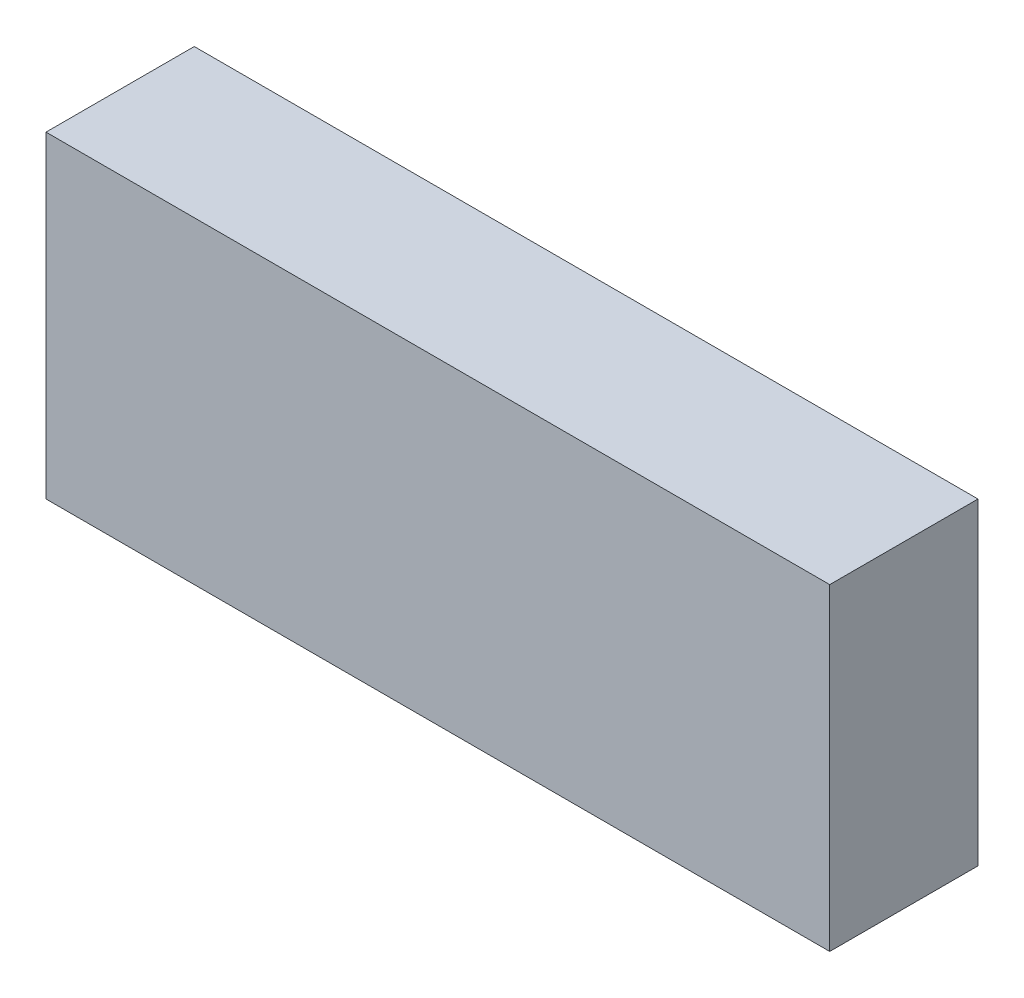
ISO-10303-21;
HEADER;
FILE_DESCRIPTION(('STEP AP214'),'2;1');
FILE_NAME('part.step','',(''),(''),'','','');
FILE_SCHEMA(('AUTOMOTIVE_DESIGN { 1 0 10303 214 1 1 1 1 }'));
ENDSEC;
DATA;
#1=APPLICATION_CONTEXT('core data for automotive mechanical design processes');
#2=APPLICATION_PROTOCOL_DEFINITION('international standard','automotive_design',2000,#1);
#3=PRODUCT_CONTEXT('',#1,'mechanical');
#4=PRODUCT('Part','Part','',(#3));
#5=PRODUCT_RELATED_PRODUCT_CATEGORY('part','',(#4));
#6=PRODUCT_DEFINITION_FORMATION('','',#4);
#7=PRODUCT_DEFINITION_CONTEXT('part definition',#1,'design');
#8=PRODUCT_DEFINITION('design','',#6,#7);
#9=PRODUCT_DEFINITION_SHAPE('','',#8);
#10=(LENGTH_UNIT() NAMED_UNIT(*) SI_UNIT(.MILLI.,.METRE.));
#11=(NAMED_UNIT(*) PLANE_ANGLE_UNIT() SI_UNIT($,.RADIAN.));
#12=(NAMED_UNIT(*) SI_UNIT($,.STERADIAN.) SOLID_ANGLE_UNIT());
#13=UNCERTAINTY_MEASURE_WITH_UNIT(LENGTH_MEASURE(1.E-05),#10,'distance_accuracy_value','');
#14=(GEOMETRIC_REPRESENTATION_CONTEXT(3) GLOBAL_UNCERTAINTY_ASSIGNED_CONTEXT((#13)) GLOBAL_UNIT_ASSIGNED_CONTEXT((#10,
#11,#12)) REPRESENTATION_CONTEXT('',''));
#15=CARTESIAN_POINT('',(0.,0.,0.));
#16=DIRECTION('',(0.,0.,1.));
#17=DIRECTION('',(1.,0.,0.));
#18=AXIS2_PLACEMENT_3D('',#15,#16,#17);
#19=CARTESIAN_POINT('',(0.,0.,7.));
#20=DIRECTION('',(1.,0.,0.));
#21=DIRECTION('',(0.,0.,-1.));
#22=AXIS2_PLACEMENT_3D('',#19,#20,#21);
#23=PLANE('',#22);
#24=DIRECTION('',(0.,-1.,0.));
#25=VECTOR('',#24,1.);
#26=CARTESIAN_POINT('',(0.,0.,0.));
#27=LINE('',#26,#25);
#28=CARTESIAN_POINT('',(0.,15.,0.));
#29=VERTEX_POINT('',#28);
#30=CARTESIAN_POINT('',(0.,0.,0.));
#31=VERTEX_POINT('',#30);
#32=EDGE_CURVE('E99',#29,#31,#27,.T.);
#33=ORIENTED_EDGE('',*,*,#32,.T.);
#34=DIRECTION('',(0.,0.,-1.));
#35=VECTOR('',#34,1.);
#36=CARTESIAN_POINT('',(0.,0.,7.));
#37=LINE('',#36,#35);
#38=CARTESIAN_POINT('',(0.,0.,7.));
#39=VERTEX_POINT('',#38);
#40=EDGE_CURVE('E11',#39,#31,#37,.T.);
#41=ORIENTED_EDGE('',*,*,#40,.F.);
#42=DIRECTION('',(0.,-1.,0.));
#43=VECTOR('',#42,1.);
#44=CARTESIAN_POINT('',(0.,0.,7.));
#45=LINE('',#44,#43);
#46=CARTESIAN_POINT('',(0.,15.,7.));
#47=VERTEX_POINT('',#46);
#48=EDGE_CURVE('E87',#47,#39,#45,.T.);
#49=ORIENTED_EDGE('',*,*,#48,.F.);
#50=DIRECTION('',(0.,0.,-1.));
#51=VECTOR('',#50,1.);
#52=CARTESIAN_POINT('',(0.,15.,7.));
#53=LINE('',#52,#51);
#54=EDGE_CURVE('E95',#47,#29,#53,.T.);
#55=ORIENTED_EDGE('',*,*,#54,.T.);
#56=EDGE_LOOP('',(#33,#41,#49,#55));
#57=FACE_BOUND('',#56,.T.);
#58=ADVANCED_FACE('F36',(#57),#23,.F.);
#59=CARTESIAN_POINT('',(0.,0.,7.));
#60=DIRECTION('',(0.,1.,0.));
#61=DIRECTION('',(0.,0.,1.));
#62=AXIS2_PLACEMENT_3D('',#59,#60,#61);
#63=PLANE('',#62);
#64=DIRECTION('',(1.,0.,0.));
#65=VECTOR('',#64,1.);
#66=CARTESIAN_POINT('',(0.,0.,0.));
#67=LINE('',#66,#65);
#68=CARTESIAN_POINT('',(37.,0.,0.));
#69=VERTEX_POINT('',#68);
#70=EDGE_CURVE('E91',#31,#69,#67,.T.);
#71=ORIENTED_EDGE('',*,*,#70,.T.);
#72=DIRECTION('',(0.,0.,-1.));
#73=VECTOR('',#72,1.);
#74=CARTESIAN_POINT('',(37.,0.,7.));
#75=LINE('',#74,#73);
#76=CARTESIAN_POINT('',(37.,0.,7.));
#77=VERTEX_POINT('',#76);
#78=EDGE_CURVE('E44',#77,#69,#75,.T.);
#79=ORIENTED_EDGE('',*,*,#78,.F.);
#80=DIRECTION('',(1.,0.,0.));
#81=VECTOR('',#80,1.);
#82=CARTESIAN_POINT('',(0.,0.,7.));
#83=LINE('',#82,#81);
#84=EDGE_CURVE('E82',#39,#77,#83,.T.);
#85=ORIENTED_EDGE('',*,*,#84,.F.);
#86=ORIENTED_EDGE('',*,*,#40,.T.);
#87=EDGE_LOOP('',(#71,#79,#85,#86));
#88=FACE_BOUND('',#87,.T.);
#89=ADVANCED_FACE('F90',(#88),#63,.F.);
#90=CARTESIAN_POINT('',(37.,0.,7.));
#91=DIRECTION('',(-1.,0.,0.));
#92=DIRECTION('',(0.,0.,1.));
#93=AXIS2_PLACEMENT_3D('',#90,#91,#92);
#94=PLANE('',#93);
#95=DIRECTION('',(0.,1.,0.));
#96=VECTOR('',#95,1.);
#97=CARTESIAN_POINT('',(37.,0.,0.));
#98=LINE('',#97,#96);
#99=CARTESIAN_POINT('',(37.,15.,0.));
#100=VERTEX_POINT('',#99);
#101=EDGE_CURVE('E69',#69,#100,#98,.T.);
#102=ORIENTED_EDGE('',*,*,#101,.T.);
#103=DIRECTION('',(0.,0.,-1.));
#104=VECTOR('',#103,1.);
#105=CARTESIAN_POINT('',(37.,15.,7.));
#106=LINE('',#105,#104);
#107=CARTESIAN_POINT('',(37.,15.,7.));
#108=VERTEX_POINT('',#107);
#109=EDGE_CURVE('E92',#108,#100,#106,.T.);
#110=ORIENTED_EDGE('',*,*,#109,.F.);
#111=DIRECTION('',(0.,1.,0.));
#112=VECTOR('',#111,1.);
#113=CARTESIAN_POINT('',(37.,0.,7.));
#114=LINE('',#113,#112);
#115=EDGE_CURVE('E85',#77,#108,#114,.T.);
#116=ORIENTED_EDGE('',*,*,#115,.F.);
#117=ORIENTED_EDGE('',*,*,#78,.T.);
#118=EDGE_LOOP('',(#102,#110,#116,#117));
#119=FACE_BOUND('',#118,.T.);
#120=ADVANCED_FACE('F93',(#119),#94,.F.);
#121=CARTESIAN_POINT('',(0.,15.,7.));
#122=DIRECTION('',(0.,-1.,0.));
#123=DIRECTION('',(0.,0.,-1.));
#124=AXIS2_PLACEMENT_3D('',#121,#122,#123);
#125=PLANE('',#124);
#126=DIRECTION('',(-1.,0.,0.));
#127=VECTOR('',#126,1.);
#128=CARTESIAN_POINT('',(0.,15.,0.));
#129=LINE('',#128,#127);
#130=EDGE_CURVE('E75',#100,#29,#129,.T.);
#131=ORIENTED_EDGE('',*,*,#130,.T.);
#132=ORIENTED_EDGE('',*,*,#54,.F.);
#133=DIRECTION('',(-1.,0.,0.));
#134=VECTOR('',#133,1.);
#135=CARTESIAN_POINT('',(0.,15.,7.));
#136=LINE('',#135,#134);
#137=EDGE_CURVE('E52',#108,#47,#136,.T.);
#138=ORIENTED_EDGE('',*,*,#137,.F.);
#139=ORIENTED_EDGE('',*,*,#109,.T.);
#140=EDGE_LOOP('',(#131,#132,#138,#139));
#141=FACE_BOUND('',#140,.T.);
#142=ADVANCED_FACE('F106',(#141),#125,.F.);
#143=CARTESIAN_POINT('',(0.,0.,7.));
#144=DIRECTION('',(0.,0.,-1.));
#145=DIRECTION('',(-1.,0.,0.));
#146=AXIS2_PLACEMENT_3D('',#143,#144,#145);
#147=PLANE('',#146);
#148=ORIENTED_EDGE('',*,*,#48,.T.);
#149=ORIENTED_EDGE('',*,*,#84,.T.);
#150=ORIENTED_EDGE('',*,*,#115,.T.);
#151=ORIENTED_EDGE('',*,*,#137,.T.);
#152=EDGE_LOOP('',(#148,#149,#150,#151));
#153=FACE_BOUND('',#152,.T.);
#154=ADVANCED_FACE('F83',(#153),#147,.F.);
#155=CARTESIAN_POINT('',(0.,0.,0.));
#156=DIRECTION('',(0.,0.,-1.));
#157=DIRECTION('',(-1.,0.,0.));
#158=AXIS2_PLACEMENT_3D('',#155,#156,#157);
#159=PLANE('',#158);
#160=ORIENTED_EDGE('',*,*,#32,.F.);
#161=ORIENTED_EDGE('',*,*,#130,.F.);
#162=ORIENTED_EDGE('',*,*,#101,.F.);
#163=ORIENTED_EDGE('',*,*,#70,.F.);
#164=EDGE_LOOP('',(#160,#161,#162,#163));
#165=FACE_BOUND('',#164,.T.);
#166=ADVANCED_FACE('F109',(#165),#159,.T.);
#167=CLOSED_SHELL('',(#58,#89,#120,#142,#154,#166));
#168=MANIFOLD_SOLID_BREP('B2',#167);
#169=ADVANCED_BREP_SHAPE_REPRESENTATION('',(#18,#168),#14);
#170=SHAPE_DEFINITION_REPRESENTATION(#9,#169);
ENDSEC;
END-ISO-10303-21;
